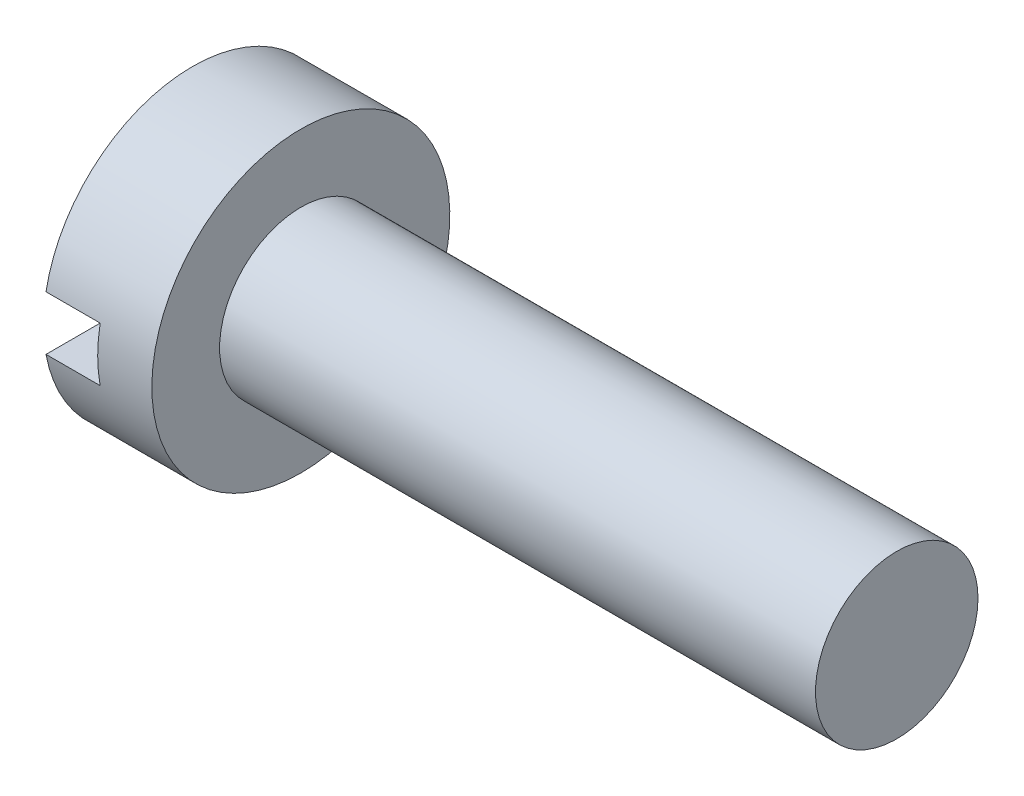
ISO-10303-21;
HEADER;
FILE_DESCRIPTION(('STEP AP214'),'2;1');
FILE_NAME('part.step','',(''),(''),'','','');
FILE_SCHEMA(('AUTOMOTIVE_DESIGN { 1 0 10303 214 1 1 1 1 }'));
ENDSEC;
DATA;
#1=APPLICATION_CONTEXT('core data for automotive mechanical design processes');
#2=APPLICATION_PROTOCOL_DEFINITION('international standard','automotive_design',2000,#1);
#3=PRODUCT_CONTEXT('',#1,'mechanical');
#4=PRODUCT('Part','Part','',(#3));
#5=PRODUCT_RELATED_PRODUCT_CATEGORY('part','',(#4));
#6=PRODUCT_DEFINITION_FORMATION('','',#4);
#7=PRODUCT_DEFINITION_CONTEXT('part definition',#1,'design');
#8=PRODUCT_DEFINITION('design','',#6,#7);
#9=PRODUCT_DEFINITION_SHAPE('','',#8);
#10=(LENGTH_UNIT() NAMED_UNIT(*) SI_UNIT(.MILLI.,.METRE.));
#11=(NAMED_UNIT(*) PLANE_ANGLE_UNIT() SI_UNIT($,.RADIAN.));
#12=(NAMED_UNIT(*) SI_UNIT($,.STERADIAN.) SOLID_ANGLE_UNIT());
#13=UNCERTAINTY_MEASURE_WITH_UNIT(LENGTH_MEASURE(1.E-05),#10,'distance_accuracy_value','');
#14=(GEOMETRIC_REPRESENTATION_CONTEXT(3) GLOBAL_UNCERTAINTY_ASSIGNED_CONTEXT((#13)) GLOBAL_UNIT_ASSIGNED_CONTEXT((#10,
#11,#12)) REPRESENTATION_CONTEXT('',''));
#15=CARTESIAN_POINT('',(0.,0.,0.));
#16=DIRECTION('',(0.,0.,1.));
#17=DIRECTION('',(1.,0.,0.));
#18=AXIS2_PLACEMENT_3D('',#15,#16,#17);
#19=CARTESIAN_POINT('',(77.0000000000005,707.33201228623,-404.607743681101));
#20=DIRECTION('',(1.,1.11022302462516E-13,0.));
#21=DIRECTION('',(-1.11022302462516E-13,1.,0.));
#22=AXIS2_PLACEMENT_3D('',#19,#20,#21);
#23=PLANE('',#22);
#24=DIRECTION('',(0.,0.,1.));
#25=VECTOR('',#24,1.);
#26=CARTESIAN_POINT('',(77.0000000000005,707.33201228623,-410.061907137699));
#27=LINE('',#26,#25);
#28=CARTESIAN_POINT('',(77.0000000000006,707.33201228623,-404.653580224503));
#29=VERTEX_POINT('',#28);
#30=CARTESIAN_POINT('',(77.0000000000005,707.33201228623,-410.061907137699));
#31=VERTEX_POINT('',#30);
#32=EDGE_CURVE('E61',#29,#31,#27,.F.);
#33=ORIENTED_EDGE('',*,*,#32,.F.);
#34=CARTESIAN_POINT('',(77.0000000000006,707.83201228623,-407.357743681101));
#35=DIRECTION('',(-1.,-1.11022302462514E-13,0.));
#36=DIRECTION('',(1.11022302462514E-13,-1.,0.));
#37=AXIS2_PLACEMENT_3D('',#34,#35,#36);
#38=CIRCLE('',#37,2.75000000000005);
#39=CARTESIAN_POINT('',(77.0000000000005,708.33201228623,-404.653580224503));
#40=VERTEX_POINT('',#39);
#41=EDGE_CURVE('E20',#40,#29,#38,.F.);
#42=ORIENTED_EDGE('',*,*,#41,.F.);
#43=DIRECTION('',(0.,0.,1.));
#44=VECTOR('',#43,1.);
#45=CARTESIAN_POINT('',(77.0000000000005,708.33201228623,-410.061907137699));
#46=LINE('',#45,#44);
#47=CARTESIAN_POINT('',(77.0000000000004,708.33201228623,-410.061907137699));
#48=VERTEX_POINT('',#47);
#49=EDGE_CURVE('E58',#48,#40,#46,.T.);
#50=ORIENTED_EDGE('',*,*,#49,.F.);
#51=CARTESIAN_POINT('',(77.0000000000004,707.83201228623,-407.357743681101));
#52=DIRECTION('',(-1.,-1.11022302462514E-13,0.));
#53=DIRECTION('',(1.11022302462514E-13,-1.,0.));
#54=AXIS2_PLACEMENT_3D('',#51,#52,#53);
#55=CIRCLE('',#54,2.75000000000005);
#56=EDGE_CURVE('E62',#31,#48,#55,.F.);
#57=ORIENTED_EDGE('',*,*,#56,.F.);
#58=EDGE_LOOP('',(#33,#42,#50,#57));
#59=FACE_BOUND('',#58,.T.);
#60=ADVANCED_FACE('F17',(#59),#23,.F.);
#61=CARTESIAN_POINT('',(76.0000000000005,708.33201228623,-410.061907137699));
#62=DIRECTION('',(1.11022302462516E-13,-1.,0.));
#63=DIRECTION('',(1.,1.11022302462516E-13,0.));
#64=AXIS2_PLACEMENT_3D('',#61,#62,#63);
#65=PLANE('',#64);
#66=DIRECTION('',(1.,1.11022302462516E-13,0.));
#67=VECTOR('',#66,1.);
#68=CARTESIAN_POINT('',(76.0000000000005,708.33201228623,-404.653580224503));
#69=LINE('',#68,#67);
#70=CARTESIAN_POINT('',(76.0000000000004,708.33201228623,-404.653580224503));
#71=VERTEX_POINT('',#70);
#72=EDGE_CURVE('E64',#40,#71,#69,.F.);
#73=ORIENTED_EDGE('',*,*,#72,.T.);
#74=DIRECTION('',(0.,0.,1.));
#75=VECTOR('',#74,1.);
#76=CARTESIAN_POINT('',(76.0000000000004,708.33201228623,-404.653580224503));
#77=LINE('',#76,#75);
#78=CARTESIAN_POINT('',(76.0000000000005,708.33201228623,-410.061907137699));
#79=VERTEX_POINT('',#78);
#80=EDGE_CURVE('E92',#79,#71,#77,.T.);
#81=ORIENTED_EDGE('',*,*,#80,.F.);
#82=DIRECTION('',(1.,1.11022302462516E-13,0.));
#83=VECTOR('',#82,1.);
#84=CARTESIAN_POINT('',(76.0000000000005,708.33201228623,-410.061907137699));
#85=LINE('',#84,#83);
#86=EDGE_CURVE('E75',#79,#48,#85,.T.);
#87=ORIENTED_EDGE('',*,*,#86,.T.);
#88=ORIENTED_EDGE('',*,*,#49,.T.);
#89=EDGE_LOOP('',(#73,#81,#87,#88));
#90=FACE_BOUND('',#89,.T.);
#91=ADVANCED_FACE('F74',(#90),#65,.T.);
#92=CARTESIAN_POINT('',(77.0000000000005,707.33201228623,-410.061907137699));
#93=DIRECTION('',(-1.11022302462516E-13,1.,0.));
#94=DIRECTION('',(-1.,-1.11022302462516E-13,0.));
#95=AXIS2_PLACEMENT_3D('',#92,#93,#94);
#96=PLANE('',#95);
#97=DIRECTION('',(-1.,-1.11022302462516E-13,0.));
#98=VECTOR('',#97,1.);
#99=CARTESIAN_POINT('',(77.0000000000005,707.33201228623,-404.653580224503));
#100=LINE('',#99,#98);
#101=CARTESIAN_POINT('',(76.0000000000005,707.33201228623,-404.653580224503));
#102=VERTEX_POINT('',#101);
#103=EDGE_CURVE('E35',#102,#29,#100,.F.);
#104=ORIENTED_EDGE('',*,*,#103,.T.);
#105=ORIENTED_EDGE('',*,*,#32,.T.);
#106=DIRECTION('',(-1.,-1.11022302462516E-13,0.));
#107=VECTOR('',#106,1.);
#108=CARTESIAN_POINT('',(77.0000000000005,707.33201228623,-410.061907137699));
#109=LINE('',#108,#107);
#110=CARTESIAN_POINT('',(76.0000000000005,707.33201228623,-410.061907137699));
#111=VERTEX_POINT('',#110);
#112=EDGE_CURVE('E72',#31,#111,#109,.T.);
#113=ORIENTED_EDGE('',*,*,#112,.T.);
#114=DIRECTION('',(0.,0.,1.));
#115=VECTOR('',#114,1.);
#116=CARTESIAN_POINT('',(76.0000000000005,707.33201228623,-404.653580224503));
#117=LINE('',#116,#115);
#118=EDGE_CURVE('E87',#102,#111,#117,.F.);
#119=ORIENTED_EDGE('',*,*,#118,.F.);
#120=EDGE_LOOP('',(#104,#105,#113,#119));
#121=FACE_BOUND('',#120,.T.);
#122=ADVANCED_FACE('F90',(#121),#96,.T.);
#123=CARTESIAN_POINT('',(76.0000000000004,708.33201228623,-404.653580224503));
#124=DIRECTION('',(-1.,-1.17190208154873E-13,0.));
#125=DIRECTION('',(1.17190208154873E-13,-1.,0.));
#126=AXIS2_PLACEMENT_3D('',#123,#124,#125);
#127=PLANE('',#126);
#128=CARTESIAN_POINT('',(76.0000000000004,707.83201228623,-407.357743681101));
#129=DIRECTION('',(-1.,-1.11022302462514E-13,0.));
#130=DIRECTION('',(1.11022302462514E-13,-1.,0.));
#131=AXIS2_PLACEMENT_3D('',#128,#129,#130);
#132=CIRCLE('',#131,2.75000000000005);
#133=EDGE_CURVE('E68',#79,#71,#132,.F.);
#134=ORIENTED_EDGE('',*,*,#133,.F.);
#135=ORIENTED_EDGE('',*,*,#80,.T.);
#136=EDGE_LOOP('',(#134,#135));
#137=FACE_BOUND('',#136,.T.);
#138=ADVANCED_FACE('F101',(#137),#127,.T.);
#139=CARTESIAN_POINT('',(76.0000000000008,705.08201228623,-404.653580224503));
#140=DIRECTION('',(-1.,-1.17190208154879E-13,0.));
#141=DIRECTION('',(1.17190208154879E-13,-1.,0.));
#142=AXIS2_PLACEMENT_3D('',#139,#140,#141);
#143=PLANE('',#142);
#144=ORIENTED_EDGE('',*,*,#118,.T.);
#145=CARTESIAN_POINT('',(76.0000000000004,707.83201228623,-407.357743681101));
#146=DIRECTION('',(-1.,-1.11022302462514E-13,0.));
#147=DIRECTION('',(1.11022302462514E-13,-1.,0.));
#148=AXIS2_PLACEMENT_3D('',#145,#146,#147);
#149=CIRCLE('',#148,2.75000000000005);
#150=EDGE_CURVE('E85',#102,#111,#149,.F.);
#151=ORIENTED_EDGE('',*,*,#150,.F.);
#152=EDGE_LOOP('',(#144,#151));
#153=FACE_BOUND('',#152,.T.);
#154=ADVANCED_FACE('F99',(#153),#143,.T.);
#155=CARTESIAN_POINT('',(78.0000000000011,707.83201228623,-407.357743681101));
#156=DIRECTION('',(-1.,-1.11022302462514E-13,0.));
#157=DIRECTION('',(1.11022302462514E-13,-1.,0.));
#158=AXIS2_PLACEMENT_3D('',#155,#156,#157);
#159=CYLINDRICAL_SURFACE('',#158,2.75000000000005);
#160=ORIENTED_EDGE('',*,*,#86,.F.);
#161=ORIENTED_EDGE('',*,*,#133,.T.);
#162=ORIENTED_EDGE('',*,*,#72,.F.);
#163=ORIENTED_EDGE('',*,*,#41,.T.);
#164=ORIENTED_EDGE('',*,*,#103,.F.);
#165=ORIENTED_EDGE('',*,*,#150,.T.);
#166=ORIENTED_EDGE('',*,*,#112,.F.);
#167=ORIENTED_EDGE('',*,*,#56,.T.);
#168=EDGE_LOOP('',(#160,#161,#162,#163,#164,#165,#166,#167));
#169=FACE_BOUND('',#168,.T.);
#170=CARTESIAN_POINT('',(78.0000000000005,707.83201228623,-407.357743681101));
#171=DIRECTION('',(-1.,-1.11022302462514E-13,0.));
#172=DIRECTION('',(1.11022302462514E-13,-1.,0.));
#173=AXIS2_PLACEMENT_3D('',#170,#171,#172);
#174=CIRCLE('',#173,2.75000000000005);
#175=CARTESIAN_POINT('',(78.0000000000008,705.08201228623,-407.357743681101));
#176=VERTEX_POINT('',#175);
#177=EDGE_CURVE('E82',#176,#176,#174,.F.);
#178=ORIENTED_EDGE('',*,*,#177,.F.);
#179=EDGE_LOOP('',(#178));
#180=FACE_BOUND('',#179,.T.);
#181=ADVANCED_FACE('F66',(#169,#180),#159,.T.);
#182=CARTESIAN_POINT('',(89.0000000000077,709.33201228623,-408.857743681101));
#183=DIRECTION('',(-1.,0.,0.));
#184=DIRECTION('',(0.,0.,1.));
#185=AXIS2_PLACEMENT_3D('',#182,#183,#184);
#186=PLANE('',#185);
#187=CARTESIAN_POINT('',(89.0000000000077,707.83201228623,-407.357743681101));
#188=DIRECTION('',(1.,0.,0.));
#189=DIRECTION('',(0.,0.,-1.));
#190=AXIS2_PLACEMENT_3D('',#187,#188,#189);
#191=CIRCLE('',#190,1.49999999999997);
#192=CARTESIAN_POINT('',(89.0000000000077,707.83201228623,-408.857743681101));
#193=VERTEX_POINT('',#192);
#194=EDGE_CURVE('E26',#193,#193,#191,.F.);
#195=ORIENTED_EDGE('',*,*,#194,.F.);
#196=EDGE_LOOP('',(#195));
#197=FACE_BOUND('',#196,.T.);
#198=ADVANCED_FACE('F108',(#197),#186,.F.);
#199=CARTESIAN_POINT('',(78.0000000000001,710.58201228623,-404.607743681101));
#200=DIRECTION('',(1.,1.13545536609392E-13,0.));
#201=DIRECTION('',(-1.13545536609392E-13,1.,0.));
#202=AXIS2_PLACEMENT_3D('',#199,#200,#201);
#203=PLANE('',#202);
#204=CARTESIAN_POINT('',(78.0000000000005,707.83201228623,-407.357743681101));
#205=DIRECTION('',(1.,0.,0.));
#206=DIRECTION('',(0.,0.,-1.));
#207=AXIS2_PLACEMENT_3D('',#204,#205,#206);
#208=CIRCLE('',#207,1.49999999999997);
#209=CARTESIAN_POINT('',(78.0000000000005,707.83201228623,-408.857743681101));
#210=VERTEX_POINT('',#209);
#211=EDGE_CURVE('E11',#210,#210,#208,.T.);
#212=ORIENTED_EDGE('',*,*,#211,.F.);
#213=EDGE_LOOP('',(#212));
#214=FACE_BOUND('',#213,.T.);
#215=ORIENTED_EDGE('',*,*,#177,.T.);
#216=EDGE_LOOP('',(#215));
#217=FACE_BOUND('',#216,.T.);
#218=ADVANCED_FACE('F114',(#214,#217),#203,.T.);
#219=CARTESIAN_POINT('',(78.0000000000005,707.83201228623,-407.357743681101));
#220=DIRECTION('',(1.,0.,0.));
#221=DIRECTION('',(0.,0.,-1.));
#222=AXIS2_PLACEMENT_3D('',#219,#220,#221);
#223=CYLINDRICAL_SURFACE('',#222,1.49999999999997);
#224=ORIENTED_EDGE('',*,*,#194,.T.);
#225=EDGE_LOOP('',(#224));
#226=FACE_BOUND('',#225,.T.);
#227=ORIENTED_EDGE('',*,*,#211,.T.);
#228=EDGE_LOOP('',(#227));
#229=FACE_BOUND('',#228,.T.);
#230=ADVANCED_FACE('F112',(#226,#229),#223,.T.);
#231=CLOSED_SHELL('',(#60,#91,#122,#138,#154,#181,#198,#218,#230));
#232=MANIFOLD_SOLID_BREP('B1',#231);
#233=ADVANCED_BREP_SHAPE_REPRESENTATION('',(#18,#232),#14);
#234=SHAPE_DEFINITION_REPRESENTATION(#9,#233);
ENDSEC;
END-ISO-10303-21;
